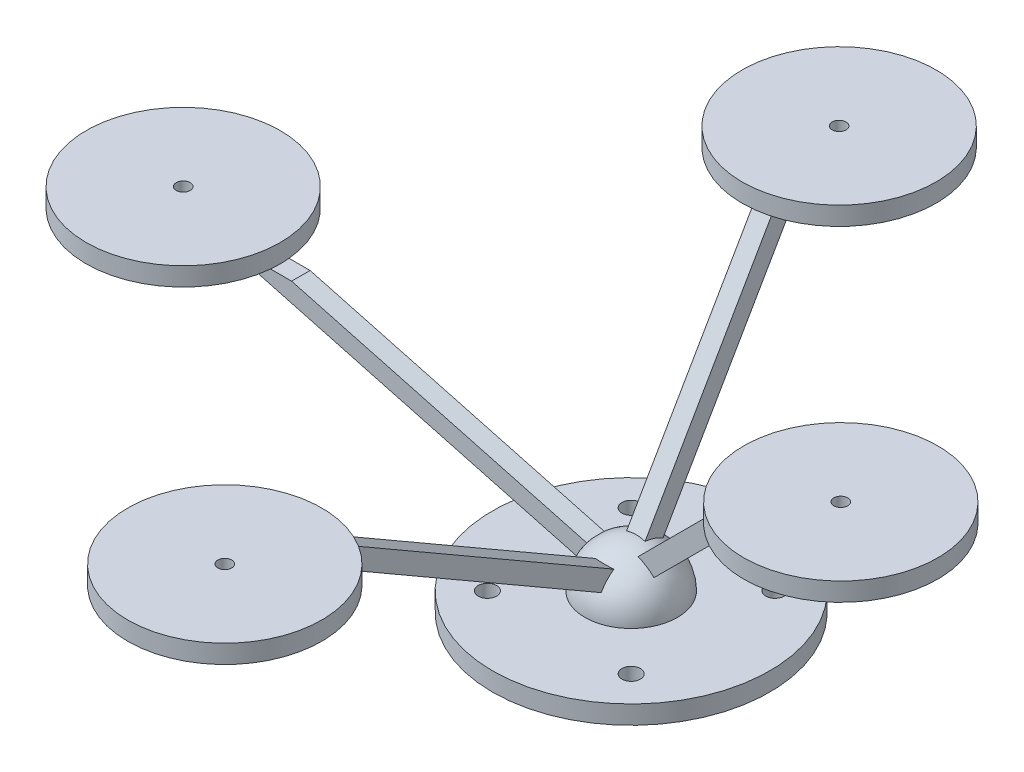
ISO-10303-21;
HEADER;
FILE_DESCRIPTION(('STEP AP214'),'2;1');
FILE_NAME('part.step','',(''),(''),'','','');
FILE_SCHEMA(('AUTOMOTIVE_DESIGN { 1 0 10303 214 1 1 1 1 }'));
ENDSEC;
DATA;
#1=APPLICATION_CONTEXT('core data for automotive mechanical design processes');
#2=APPLICATION_PROTOCOL_DEFINITION('international standard','automotive_design',2000,#1);
#3=PRODUCT_CONTEXT('',#1,'mechanical');
#4=PRODUCT('Part','Part','',(#3));
#5=PRODUCT_RELATED_PRODUCT_CATEGORY('part','',(#4));
#6=PRODUCT_DEFINITION_FORMATION('','',#4);
#7=PRODUCT_DEFINITION_CONTEXT('part definition',#1,'design');
#8=PRODUCT_DEFINITION('design','',#6,#7);
#9=PRODUCT_DEFINITION_SHAPE('','',#8);
#10=(LENGTH_UNIT() NAMED_UNIT(*) SI_UNIT(.MILLI.,.METRE.));
#11=(NAMED_UNIT(*) PLANE_ANGLE_UNIT() SI_UNIT($,.RADIAN.));
#12=(NAMED_UNIT(*) SI_UNIT($,.STERADIAN.) SOLID_ANGLE_UNIT());
#13=UNCERTAINTY_MEASURE_WITH_UNIT(LENGTH_MEASURE(1.E-05),#10,'distance_accuracy_value','');
#14=(GEOMETRIC_REPRESENTATION_CONTEXT(3) GLOBAL_UNCERTAINTY_ASSIGNED_CONTEXT((#13)) GLOBAL_UNIT_ASSIGNED_CONTEXT((#10,
#11,#12)) REPRESENTATION_CONTEXT('',''));
#15=CARTESIAN_POINT('',(0.,0.,0.));
#16=DIRECTION('',(0.,0.,1.));
#17=DIRECTION('',(1.,0.,0.));
#18=AXIS2_PLACEMENT_3D('',#15,#16,#17);
#19=CARTESIAN_POINT('',(0.,2.,0.));
#20=DIRECTION('',(0.,-1.,0.));
#21=DIRECTION('',(0.,0.,-1.));
#22=AXIS2_PLACEMENT_3D('',#19,#20,#21);
#23=SPHERICAL_SURFACE('',#22,5.);
#24=CARTESIAN_POINT('',(0.,2.,1.));
#25=DIRECTION('',(0.,0.,1.));
#26=DIRECTION('',(1.,0.,0.));
#27=AXIS2_PLACEMENT_3D('',#24,#25,#26);
#28=CIRCLE('',#27,4.89897948556636);
#29=CARTESIAN_POINT('',(-4.73205080756888,3.26794919243113,1.));
#30=VERTEX_POINT('',#29);
#31=CARTESIAN_POINT('',(-3.80211352740498,5.08932561001978,1.));
#32=VERTEX_POINT('',#31);
#33=EDGE_CURVE('E348',#30,#32,#28,.F.);
#34=ORIENTED_EDGE('',*,*,#33,.F.);
#35=CARTESIAN_POINT('',(0.,2.,0.));
#36=DIRECTION('',(0.258819045102521,0.965925826289068,0.));
#37=DIRECTION('',(-0.965925826289068,0.258819045102521,0.));
#38=AXIS2_PLACEMENT_3D('',#35,#36,#37);
#39=CIRCLE('',#38,5.);
#40=CARTESIAN_POINT('',(-4.73205080756888,3.26794919243113,-1.));
#41=VERTEX_POINT('',#40);
#42=EDGE_CURVE('E353',#30,#41,#39,.F.);
#43=ORIENTED_EDGE('',*,*,#42,.T.);
#44=CARTESIAN_POINT('',(0.,2.,-1.));
#45=DIRECTION('',(0.,0.,1.));
#46=DIRECTION('',(1.,0.,0.));
#47=AXIS2_PLACEMENT_3D('',#44,#45,#46);
#48=CIRCLE('',#47,4.89897948556636);
#49=CARTESIAN_POINT('',(-3.80211352740498,5.08932561001978,-1.));
#50=VERTEX_POINT('',#49);
#51=EDGE_CURVE('E337',#41,#50,#48,.F.);
#52=ORIENTED_EDGE('',*,*,#51,.T.);
#53=CARTESIAN_POINT('',(0.517638090205043,3.93185165257814,0.));
#54=DIRECTION('',(-0.258819045102521,-0.965925826289068,0.));
#55=DIRECTION('',(0.965925826289068,-0.258819045102521,0.));
#56=AXIS2_PLACEMENT_3D('',#53,#54,#55);
#57=CIRCLE('',#56,4.58257569495584);
#58=EDGE_CURVE('E349',#50,#32,#57,.F.);
#59=ORIENTED_EDGE('',*,*,#58,.T.);
#60=EDGE_LOOP('',(#34,#43,#52,#59));
#61=FACE_BOUND('',#60,.T.);
#62=CARTESIAN_POINT('',(1.74806409779531,6.57649122254147,1.));
#63=VERTEX_POINT('',#62);
#64=CARTESIAN_POINT('',(3.46410161513777,5.46410161513774,1.));
#65=VERTEX_POINT('',#64);
#66=EDGE_CURVE('E345',#63,#65,#28,.F.);
#67=ORIENTED_EDGE('',*,*,#66,.F.);
#68=CARTESIAN_POINT('',(-1.41421356237309,3.4142135623731,0.));
#69=DIRECTION('',(0.707106781186544,-0.707106781186551,0.));
#70=DIRECTION('',(0.707106781186551,0.707106781186544,0.));
#71=AXIS2_PLACEMENT_3D('',#68,#69,#70);
#72=CIRCLE('',#71,4.58257569495584);
#73=CARTESIAN_POINT('',(1.74806409779531,6.57649122254147,-1.));
#74=VERTEX_POINT('',#73);
#75=EDGE_CURVE('E336',#63,#74,#72,.F.);
#76=ORIENTED_EDGE('',*,*,#75,.T.);
#77=CARTESIAN_POINT('',(3.46410161513777,5.46410161513774,-1.));
#78=VERTEX_POINT('',#77);
#79=EDGE_CURVE('E332',#74,#78,#48,.F.);
#80=ORIENTED_EDGE('',*,*,#79,.T.);
#81=CARTESIAN_POINT('',(0.,2.,0.));
#82=DIRECTION('',(-0.707106781186544,0.707106781186551,0.));
#83=DIRECTION('',(-0.707106781186551,-0.707106781186544,0.));
#84=AXIS2_PLACEMENT_3D('',#81,#82,#83);
#85=CIRCLE('',#84,5.);
#86=EDGE_CURVE('E341',#78,#65,#85,.F.);
#87=ORIENTED_EDGE('',*,*,#86,.T.);
#88=EDGE_LOOP('',(#67,#76,#80,#87));
#89=FACE_BOUND('',#88,.T.);
#90=CARTESIAN_POINT('',(0.,2.,0.));
#91=DIRECTION('',(0.,1.,0.));
#92=DIRECTION('',(0.,0.,1.));
#93=AXIS2_PLACEMENT_3D('',#90,#91,#92);
#94=CIRCLE('',#93,5.);
#95=CARTESIAN_POINT('',(0.,2.,5.));
#96=VERTEX_POINT('',#95);
#97=EDGE_CURVE('E325',#96,#96,#94,.T.);
#98=ORIENTED_EDGE('',*,*,#97,.T.);
#99=EDGE_LOOP('',(#98));
#100=FACE_BOUND('',#99,.T.);
#101=CARTESIAN_POINT('',(0.,3.73205080756888,-1.));
#102=DIRECTION('',(0.,-0.866025403784438,0.500000000000001));
#103=DIRECTION('',(0.,-0.500000000000001,-0.866025403784438));
#104=AXIS2_PLACEMENT_3D('',#101,#102,#103);
#105=CIRCLE('',#104,4.58257569495584);
#106=CARTESIAN_POINT('',(-1.,5.96811878506867,2.87298334620742));
#107=VERTEX_POINT('',#106);
#108=CARTESIAN_POINT('',(1.,5.96811878506867,2.87298334620742));
#109=VERTEX_POINT('',#108);
#110=EDGE_CURVE('E177',#107,#109,#105,.F.);
#111=ORIENTED_EDGE('',*,*,#110,.T.);
#112=CARTESIAN_POINT('',(1.,2.,0.));
#113=DIRECTION('',(-1.,0.,0.));
#114=DIRECTION('',(0.,0.,1.));
#115=AXIS2_PLACEMENT_3D('',#112,#113,#114);
#116=CIRCLE('',#115,4.89897948556636);
#117=CARTESIAN_POINT('',(1.,4.44948974278318,4.24264068711928));
#118=VERTEX_POINT('',#117);
#119=EDGE_CURVE('E50',#109,#118,#116,.F.);
#120=ORIENTED_EDGE('',*,*,#119,.T.);
#121=CARTESIAN_POINT('',(0.,2.,0.));
#122=DIRECTION('',(0.,0.866025403784438,-0.500000000000001));
#123=DIRECTION('',(0.,0.500000000000001,0.866025403784438));
#124=AXIS2_PLACEMENT_3D('',#121,#122,#123);
#125=CIRCLE('',#124,5.);
#126=CARTESIAN_POINT('',(-1.,4.44948974278318,4.24264068711928));
#127=VERTEX_POINT('',#126);
#128=EDGE_CURVE('E363',#118,#127,#125,.F.);
#129=ORIENTED_EDGE('',*,*,#128,.T.);
#130=CARTESIAN_POINT('',(-1.,2.,0.));
#131=DIRECTION('',(-1.,0.,0.));
#132=DIRECTION('',(0.,0.,1.));
#133=AXIS2_PLACEMENT_3D('',#130,#131,#132);
#134=CIRCLE('',#133,4.89897948556636);
#135=EDGE_CURVE('E357',#107,#127,#134,.F.);
#136=ORIENTED_EDGE('',*,*,#135,.F.);
#137=EDGE_LOOP('',(#111,#120,#129,#136));
#138=FACE_BOUND('',#137,.T.);
#139=CARTESIAN_POINT('',(0.,2.,0.));
#140=DIRECTION('',(0.,0.500000000000004,0.866025403784436));
#141=DIRECTION('',(0.,-0.866025403784436,0.500000000000004));
#142=AXIS2_PLACEMENT_3D('',#139,#140,#141);
#143=CIRCLE('',#142,5.);
#144=CARTESIAN_POINT('',(-1.,6.24264068711927,-2.4494897427832));
#145=VERTEX_POINT('',#144);
#146=CARTESIAN_POINT('',(1.,6.24264068711927,-2.4494897427832));
#147=VERTEX_POINT('',#146);
#148=EDGE_CURVE('E43',#145,#147,#143,.F.);
#149=ORIENTED_EDGE('',*,*,#148,.T.);
#150=CARTESIAN_POINT('',(1.,6.87298334620741,-0.504017169930936));
#151=VERTEX_POINT('',#150);
#152=EDGE_CURVE('E11',#147,#151,#116,.F.);
#153=ORIENTED_EDGE('',*,*,#152,.T.);
#154=CARTESIAN_POINT('',(0.,3.00000000000001,1.73205080756887));
#155=DIRECTION('',(0.,-0.500000000000004,-0.866025403784436));
#156=DIRECTION('',(0.,0.866025403784436,-0.500000000000004));
#157=AXIS2_PLACEMENT_3D('',#154,#155,#156);
#158=CIRCLE('',#157,4.58257569495584);
#159=CARTESIAN_POINT('',(-1.,6.87298334620742,-0.504017169930936));
#160=VERTEX_POINT('',#159);
#161=EDGE_CURVE('E366',#151,#160,#158,.F.);
#162=ORIENTED_EDGE('',*,*,#161,.T.);
#163=EDGE_CURVE('E360',#145,#160,#134,.F.);
#164=ORIENTED_EDGE('',*,*,#163,.F.);
#165=EDGE_LOOP('',(#149,#153,#162,#164));
#166=FACE_BOUND('',#165,.T.);
#167=ADVANCED_FACE('F39',(#61,#89,#100,#138,#166),#23,.T.);
#168=CARTESIAN_POINT('',(0.,2.,0.));
#169=DIRECTION('',(0.,1.,0.));
#170=DIRECTION('',(0.,0.,1.));
#171=AXIS2_PLACEMENT_3D('',#168,#169,#170);
#172=PLANE('',#171);
#173=ORIENTED_EDGE('',*,*,#97,.F.);
#174=EDGE_LOOP('',(#173));
#175=FACE_BOUND('',#174,.T.);
#176=CARTESIAN_POINT('',(-7.77817459305207,2.,7.77817459305198));
#177=DIRECTION('',(0.,1.,0.));
#178=DIRECTION('',(0.,0.,1.));
#179=AXIS2_PLACEMENT_3D('',#176,#177,#178);
#180=CIRCLE('',#179,1.);
#181=CARTESIAN_POINT('',(-7.77817459305207,2.,8.77817459305198));
#182=VERTEX_POINT('',#181);
#183=EDGE_CURVE('E297',#182,#182,#180,.T.);
#184=ORIENTED_EDGE('',*,*,#183,.F.);
#185=EDGE_LOOP('',(#184));
#186=FACE_BOUND('',#185,.T.);
#187=CARTESIAN_POINT('',(7.77817459305206,2.,-7.77817459305199));
#188=DIRECTION('',(0.,1.,0.));
#189=DIRECTION('',(0.,0.,1.));
#190=AXIS2_PLACEMENT_3D('',#187,#188,#189);
#191=CIRCLE('',#190,1.);
#192=CARTESIAN_POINT('',(7.77817459305206,2.,-6.77817459305198));
#193=VERTEX_POINT('',#192);
#194=EDGE_CURVE('E313',#193,#193,#191,.T.);
#195=ORIENTED_EDGE('',*,*,#194,.F.);
#196=EDGE_LOOP('',(#195));
#197=FACE_BOUND('',#196,.T.);
#198=CARTESIAN_POINT('',(0.,2.,0.));
#199=DIRECTION('',(0.,1.,0.));
#200=DIRECTION('',(0.,0.,1.));
#201=AXIS2_PLACEMENT_3D('',#198,#199,#200);
#202=CIRCLE('',#201,15.);
#203=CARTESIAN_POINT('',(0.,2.,15.));
#204=VERTEX_POINT('',#203);
#205=EDGE_CURVE('E321',#204,#204,#202,.T.);
#206=ORIENTED_EDGE('',*,*,#205,.T.);
#207=EDGE_LOOP('',(#206));
#208=FACE_BOUND('',#207,.T.);
#209=CARTESIAN_POINT('',(-7.77817459305204,2.,-7.77817459305201));
#210=DIRECTION('',(0.,1.,0.));
#211=DIRECTION('',(0.,0.,1.));
#212=AXIS2_PLACEMENT_3D('',#209,#210,#211);
#213=CIRCLE('',#212,0.999999999999995);
#214=CARTESIAN_POINT('',(-7.77817459305204,2.,-6.77817459305201));
#215=VERTEX_POINT('',#214);
#216=EDGE_CURVE('E305',#215,#215,#213,.T.);
#217=ORIENTED_EDGE('',*,*,#216,.F.);
#218=EDGE_LOOP('',(#217));
#219=FACE_BOUND('',#218,.T.);
#220=CARTESIAN_POINT('',(7.77817459305204,2.,7.77817459305201));
#221=DIRECTION('',(0.,1.,0.));
#222=DIRECTION('',(0.,0.,1.));
#223=AXIS2_PLACEMENT_3D('',#220,#221,#222);
#224=CIRCLE('',#223,1.);
#225=CARTESIAN_POINT('',(7.77817459305204,2.,8.77817459305201));
#226=VERTEX_POINT('',#225);
#227=EDGE_CURVE('E289',#226,#226,#224,.T.);
#228=ORIENTED_EDGE('',*,*,#227,.F.);
#229=EDGE_LOOP('',(#228));
#230=FACE_BOUND('',#229,.T.);
#231=ADVANCED_FACE('F463',(#175,#186,#197,#208,#219,#230),#172,.T.);
#232=CARTESIAN_POINT('',(0.,0.,0.));
#233=DIRECTION('',(0.,1.,0.));
#234=DIRECTION('',(0.,0.,1.));
#235=AXIS2_PLACEMENT_3D('',#232,#233,#234);
#236=PLANE('',#235);
#237=CARTESIAN_POINT('',(0.,0.,0.));
#238=DIRECTION('',(0.,1.,0.));
#239=DIRECTION('',(0.,0.,1.));
#240=AXIS2_PLACEMENT_3D('',#237,#238,#239);
#241=CIRCLE('',#240,15.);
#242=CARTESIAN_POINT('',(0.,0.,15.));
#243=VERTEX_POINT('',#242);
#244=EDGE_CURVE('E317',#243,#243,#241,.T.);
#245=ORIENTED_EDGE('',*,*,#244,.F.);
#246=EDGE_LOOP('',(#245));
#247=FACE_BOUND('',#246,.T.);
#248=CARTESIAN_POINT('',(7.77817459305206,0.,-7.77817459305199));
#249=DIRECTION('',(0.,1.,0.));
#250=DIRECTION('',(0.,0.,1.));
#251=AXIS2_PLACEMENT_3D('',#248,#249,#250);
#252=CIRCLE('',#251,1.);
#253=CARTESIAN_POINT('',(7.77817459305206,0.,-6.77817459305198));
#254=VERTEX_POINT('',#253);
#255=EDGE_CURVE('E309',#254,#254,#252,.T.);
#256=ORIENTED_EDGE('',*,*,#255,.T.);
#257=EDGE_LOOP('',(#256));
#258=FACE_BOUND('',#257,.T.);
#259=CARTESIAN_POINT('',(-7.77817459305204,0.,-7.77817459305201));
#260=DIRECTION('',(0.,1.,0.));
#261=DIRECTION('',(0.,0.,1.));
#262=AXIS2_PLACEMENT_3D('',#259,#260,#261);
#263=CIRCLE('',#262,0.999999999999995);
#264=CARTESIAN_POINT('',(-7.77817459305204,0.,-6.77817459305201));
#265=VERTEX_POINT('',#264);
#266=EDGE_CURVE('E301',#265,#265,#263,.T.);
#267=ORIENTED_EDGE('',*,*,#266,.T.);
#268=EDGE_LOOP('',(#267));
#269=FACE_BOUND('',#268,.T.);
#270=CARTESIAN_POINT('',(-7.77817459305207,0.,7.77817459305198));
#271=DIRECTION('',(0.,1.,0.));
#272=DIRECTION('',(0.,0.,1.));
#273=AXIS2_PLACEMENT_3D('',#270,#271,#272);
#274=CIRCLE('',#273,1.);
#275=CARTESIAN_POINT('',(-7.77817459305207,0.,8.77817459305198));
#276=VERTEX_POINT('',#275);
#277=EDGE_CURVE('E293',#276,#276,#274,.T.);
#278=ORIENTED_EDGE('',*,*,#277,.T.);
#279=EDGE_LOOP('',(#278));
#280=FACE_BOUND('',#279,.T.);
#281=CARTESIAN_POINT('',(7.77817459305204,0.,7.77817459305201));
#282=DIRECTION('',(0.,1.,0.));
#283=DIRECTION('',(0.,0.,1.));
#284=AXIS2_PLACEMENT_3D('',#281,#282,#283);
#285=CIRCLE('',#284,1.);
#286=CARTESIAN_POINT('',(7.77817459305204,0.,8.77817459305201));
#287=VERTEX_POINT('',#286);
#288=EDGE_CURVE('E288',#287,#287,#285,.T.);
#289=ORIENTED_EDGE('',*,*,#288,.T.);
#290=EDGE_LOOP('',(#289));
#291=FACE_BOUND('',#290,.T.);
#292=ADVANCED_FACE('F471',(#247,#258,#269,#280,#291),#236,.F.);
#293=CARTESIAN_POINT('',(0.,2.,0.));
#294=DIRECTION('',(0.,-1.,0.));
#295=DIRECTION('',(0.,0.,-1.));
#296=AXIS2_PLACEMENT_3D('',#293,#294,#295);
#297=CYLINDRICAL_SURFACE('',#296,15.);
#298=ORIENTED_EDGE('',*,*,#205,.F.);
#299=EDGE_LOOP('',(#298));
#300=FACE_BOUND('',#299,.T.);
#301=ORIENTED_EDGE('',*,*,#244,.T.);
#302=EDGE_LOOP('',(#301));
#303=FACE_BOUND('',#302,.T.);
#304=ADVANCED_FACE('F41',(#300,#303),#297,.T.);
#305=CARTESIAN_POINT('',(7.77817459305206,2.,-7.77817459305199));
#306=DIRECTION('',(0.,-1.,0.));
#307=DIRECTION('',(0.,0.,-1.));
#308=AXIS2_PLACEMENT_3D('',#305,#306,#307);
#309=CYLINDRICAL_SURFACE('',#308,1.);
#310=ORIENTED_EDGE('',*,*,#194,.T.);
#311=EDGE_LOOP('',(#310));
#312=FACE_BOUND('',#311,.T.);
#313=ORIENTED_EDGE('',*,*,#255,.F.);
#314=EDGE_LOOP('',(#313));
#315=FACE_BOUND('',#314,.T.);
#316=ADVANCED_FACE('F492',(#312,#315),#309,.F.);
#317=CARTESIAN_POINT('',(-7.77817459305204,2.,-7.77817459305201));
#318=DIRECTION('',(0.,-1.,0.));
#319=DIRECTION('',(0.,0.,-1.));
#320=AXIS2_PLACEMENT_3D('',#317,#318,#319);
#321=CYLINDRICAL_SURFACE('',#320,0.999999999999995);
#322=ORIENTED_EDGE('',*,*,#216,.T.);
#323=EDGE_LOOP('',(#322));
#324=FACE_BOUND('',#323,.T.);
#325=ORIENTED_EDGE('',*,*,#266,.F.);
#326=EDGE_LOOP('',(#325));
#327=FACE_BOUND('',#326,.T.);
#328=ADVANCED_FACE('F488',(#324,#327),#321,.F.);
#329=CARTESIAN_POINT('',(-7.77817459305207,2.,7.77817459305198));
#330=DIRECTION('',(0.,-1.,0.));
#331=DIRECTION('',(0.,0.,-1.));
#332=AXIS2_PLACEMENT_3D('',#329,#330,#331);
#333=CYLINDRICAL_SURFACE('',#332,1.);
#334=ORIENTED_EDGE('',*,*,#183,.T.);
#335=EDGE_LOOP('',(#334));
#336=FACE_BOUND('',#335,.T.);
#337=ORIENTED_EDGE('',*,*,#277,.F.);
#338=EDGE_LOOP('',(#337));
#339=FACE_BOUND('',#338,.T.);
#340=ADVANCED_FACE('F484',(#336,#339),#333,.F.);
#341=CARTESIAN_POINT('',(7.77817459305204,2.,7.77817459305201));
#342=DIRECTION('',(0.,-1.,0.));
#343=DIRECTION('',(0.,0.,-1.));
#344=AXIS2_PLACEMENT_3D('',#341,#342,#343);
#345=CYLINDRICAL_SURFACE('',#344,1.);
#346=ORIENTED_EDGE('',*,*,#227,.T.);
#347=EDGE_LOOP('',(#346));
#348=FACE_BOUND('',#347,.T.);
#349=ORIENTED_EDGE('',*,*,#288,.F.);
#350=EDGE_LOOP('',(#349));
#351=FACE_BOUND('',#350,.T.);
#352=ADVANCED_FACE('F480',(#348,#351),#345,.F.);
#353=CARTESIAN_POINT('',(0.,0.,-1.));
#354=DIRECTION('',(0.,0.,1.));
#355=DIRECTION('',(1.,0.,0.));
#356=AXIS2_PLACEMENT_3D('',#353,#354,#355);
#357=PLANE('',#356);
#358=ORIENTED_EDGE('',*,*,#79,.F.);
#359=DIRECTION('',(-0.707106781186551,-0.707106781186544,0.));
#360=VECTOR('',#359,1.);
#361=CARTESIAN_POINT('',(0.,4.82842712474617,-1.));
#362=LINE('',#361,#360);
#363=CARTESIAN_POINT('',(14.8492424049176,19.6776695296636,-1.));
#364=VERTEX_POINT('',#363);
#365=EDGE_CURVE('E265',#364,#74,#362,.T.);
#366=ORIENTED_EDGE('',*,*,#365,.F.);
#367=DIRECTION('',(-1.,0.,0.));
#368=VECTOR('',#367,1.);
#369=CARTESIAN_POINT('',(14.8492424049176,19.6776695296636,-1.));
#370=LINE('',#369,#368);
#371=CARTESIAN_POINT('',(17.6776695296638,19.6776695296636,-1.));
#372=VERTEX_POINT('',#371);
#373=EDGE_CURVE('E261',#372,#364,#370,.T.);
#374=ORIENTED_EDGE('',*,*,#373,.F.);
#375=DIRECTION('',(0.707106781186551,0.707106781186544,0.));
#376=VECTOR('',#375,1.);
#377=CARTESIAN_POINT('',(0.,2.,-1.));
#378=LINE('',#377,#376);
#379=EDGE_CURVE('E257',#78,#372,#378,.T.);
#380=ORIENTED_EDGE('',*,*,#379,.F.);
#381=EDGE_LOOP('',(#358,#366,#374,#380));
#382=FACE_BOUND('',#381,.T.);
#383=ADVANCED_FACE('F483',(#382),#357,.F.);
#384=CARTESIAN_POINT('',(0.,0.,1.));
#385=DIRECTION('',(0.,0.,1.));
#386=DIRECTION('',(1.,0.,0.));
#387=AXIS2_PLACEMENT_3D('',#384,#385,#386);
#388=PLANE('',#387);
#389=DIRECTION('',(-0.707106781186551,-0.707106781186544,0.));
#390=VECTOR('',#389,1.);
#391=CARTESIAN_POINT('',(0.,4.82842712474617,1.));
#392=LINE('',#391,#390);
#393=CARTESIAN_POINT('',(14.8492424049176,19.6776695296636,1.));
#394=VERTEX_POINT('',#393);
#395=EDGE_CURVE('E241',#394,#63,#392,.T.);
#396=ORIENTED_EDGE('',*,*,#395,.T.);
#397=ORIENTED_EDGE('',*,*,#66,.T.);
#398=DIRECTION('',(0.707106781186551,0.707106781186544,0.));
#399=VECTOR('',#398,1.);
#400=CARTESIAN_POINT('',(0.,2.,1.));
#401=LINE('',#400,#399);
#402=CARTESIAN_POINT('',(17.6776695296638,19.6776695296636,1.));
#403=VERTEX_POINT('',#402);
#404=EDGE_CURVE('E234',#65,#403,#401,.T.);
#405=ORIENTED_EDGE('',*,*,#404,.T.);
#406=DIRECTION('',(-1.,0.,0.));
#407=VECTOR('',#406,1.);
#408=CARTESIAN_POINT('',(14.8492424049176,19.6776695296636,1.));
#409=LINE('',#408,#407);
#410=EDGE_CURVE('E238',#403,#394,#409,.T.);
#411=ORIENTED_EDGE('',*,*,#410,.T.);
#412=EDGE_LOOP('',(#396,#397,#405,#411));
#413=FACE_BOUND('',#412,.T.);
#414=ADVANCED_FACE('F553',(#413),#388,.T.);
#415=CARTESIAN_POINT('',(0.,4.82842712474617,1.));
#416=DIRECTION('',(0.707106781186544,-0.707106781186551,0.));
#417=DIRECTION('',(0.707106781186551,0.707106781186544,0.));
#418=AXIS2_PLACEMENT_3D('',#415,#416,#417);
#419=PLANE('',#418);
#420=ORIENTED_EDGE('',*,*,#75,.F.);
#421=ORIENTED_EDGE('',*,*,#395,.F.);
#422=DIRECTION('',(0.,0.,-1.));
#423=VECTOR('',#422,1.);
#424=CARTESIAN_POINT('',(14.8492424049176,19.6776695296636,1.));
#425=LINE('',#424,#423);
#426=EDGE_CURVE('E281',#394,#364,#425,.T.);
#427=ORIENTED_EDGE('',*,*,#426,.T.);
#428=ORIENTED_EDGE('',*,*,#365,.T.);
#429=EDGE_LOOP('',(#420,#421,#427,#428));
#430=FACE_BOUND('',#429,.T.);
#431=ADVANCED_FACE('F563',(#430),#419,.F.);
#432=CARTESIAN_POINT('',(0.,2.,1.));
#433=DIRECTION('',(-0.707106781186544,0.707106781186551,0.));
#434=DIRECTION('',(-0.707106781186551,-0.707106781186544,0.));
#435=AXIS2_PLACEMENT_3D('',#432,#433,#434);
#436=PLANE('',#435);
#437=ORIENTED_EDGE('',*,*,#86,.F.);
#438=ORIENTED_EDGE('',*,*,#379,.T.);
#439=DIRECTION('',(0.,0.,-1.));
#440=VECTOR('',#439,1.);
#441=CARTESIAN_POINT('',(17.6776695296638,19.6776695296636,1.));
#442=LINE('',#441,#440);
#443=EDGE_CURVE('E284',#403,#372,#442,.T.);
#444=ORIENTED_EDGE('',*,*,#443,.F.);
#445=ORIENTED_EDGE('',*,*,#404,.F.);
#446=EDGE_LOOP('',(#437,#438,#444,#445));
#447=FACE_BOUND('',#446,.T.);
#448=ADVANCED_FACE('F572',(#447),#436,.F.);
#449=DIRECTION('',(0.965925826289068,-0.258819045102521,0.));
#450=VECTOR('',#449,1.);
#451=CARTESIAN_POINT('',(0.,2.,1.));
#452=LINE('',#451,#450);
#453=CARTESIAN_POINT('',(-43.4666621830081,13.6468570296135,1.));
#454=VERTEX_POINT('',#453);
#455=EDGE_CURVE('E230',#454,#30,#452,.T.);
#456=ORIENTED_EDGE('',*,*,#455,.T.);
#457=ORIENTED_EDGE('',*,*,#33,.T.);
#458=DIRECTION('',(-0.965925826289068,0.258819045102521,0.));
#459=VECTOR('',#458,1.);
#460=CARTESIAN_POINT('',(-35.7392555726955,13.6468570296135,1.));
#461=LINE('',#460,#459);
#462=CARTESIAN_POINT('',(-35.7392555726955,13.6468570296135,1.));
#463=VERTEX_POINT('',#462);
#464=EDGE_CURVE('E245',#32,#463,#461,.T.);
#465=ORIENTED_EDGE('',*,*,#464,.T.);
#466=DIRECTION('',(-1.,0.,0.));
#467=VECTOR('',#466,1.);
#468=CARTESIAN_POINT('',(-43.4666621830081,13.6468570296135,1.));
#469=LINE('',#468,#467);
#470=CARTESIAN_POINT('',(-38.0143897028246,13.6468570296135,1.));
#471=VERTEX_POINT('',#470);
#472=EDGE_CURVE('E249',#463,#471,#469,.T.);
#473=ORIENTED_EDGE('',*,*,#472,.T.);
#474=EDGE_CURVE('E248',#471,#454,#469,.T.);
#475=ORIENTED_EDGE('',*,*,#474,.T.);
#476=EDGE_LOOP('',(#456,#457,#465,#473,#475));
#477=FACE_BOUND('',#476,.T.);
#478=ADVANCED_FACE('F566',(#477),#388,.T.);
#479=ORIENTED_EDGE('',*,*,#51,.F.);
#480=DIRECTION('',(0.965925826289068,-0.258819045102521,0.));
#481=VECTOR('',#480,1.);
#482=CARTESIAN_POINT('',(0.,2.,-1.));
#483=LINE('',#482,#481);
#484=CARTESIAN_POINT('',(-43.4666621830081,13.6468570296135,-1.));
#485=VERTEX_POINT('',#484);
#486=EDGE_CURVE('E226',#485,#41,#483,.T.);
#487=ORIENTED_EDGE('',*,*,#486,.F.);
#488=DIRECTION('',(-1.,0.,0.));
#489=VECTOR('',#488,1.);
#490=CARTESIAN_POINT('',(-43.4666621830081,13.6468570296135,-1.));
#491=LINE('',#490,#489);
#492=CARTESIAN_POINT('',(-38.0143897028246,13.6468570296135,-1.));
#493=VERTEX_POINT('',#492);
#494=EDGE_CURVE('E272',#493,#485,#491,.T.);
#495=ORIENTED_EDGE('',*,*,#494,.F.);
#496=CARTESIAN_POINT('',(-35.7392555726955,13.6468570296135,-1.));
#497=VERTEX_POINT('',#496);
#498=EDGE_CURVE('E235',#497,#493,#491,.T.);
#499=ORIENTED_EDGE('',*,*,#498,.F.);
#500=DIRECTION('',(-0.965925826289068,0.258819045102521,0.));
#501=VECTOR('',#500,1.);
#502=CARTESIAN_POINT('',(-35.7392555726955,13.6468570296135,-1.));
#503=LINE('',#502,#501);
#504=EDGE_CURVE('E269',#50,#497,#503,.T.);
#505=ORIENTED_EDGE('',*,*,#504,.F.);
#506=EDGE_LOOP('',(#479,#487,#495,#499,#505));
#507=FACE_BOUND('',#506,.T.);
#508=ADVANCED_FACE('F556',(#507),#357,.F.);
#509=CARTESIAN_POINT('',(0.,2.,1.));
#510=DIRECTION('',(0.258819045102521,0.965925826289068,0.));
#511=DIRECTION('',(-0.965925826289068,0.258819045102521,0.));
#512=AXIS2_PLACEMENT_3D('',#509,#510,#511);
#513=PLANE('',#512);
#514=ORIENTED_EDGE('',*,*,#42,.F.);
#515=ORIENTED_EDGE('',*,*,#455,.F.);
#516=DIRECTION('',(0.,0.,-1.));
#517=VECTOR('',#516,1.);
#518=CARTESIAN_POINT('',(-43.4666621830081,13.6468570296135,1.));
#519=LINE('',#518,#517);
#520=EDGE_CURVE('E253',#454,#485,#519,.T.);
#521=ORIENTED_EDGE('',*,*,#520,.T.);
#522=ORIENTED_EDGE('',*,*,#486,.T.);
#523=EDGE_LOOP('',(#514,#515,#521,#522));
#524=FACE_BOUND('',#523,.T.);
#525=ADVANCED_FACE('F478',(#524),#513,.F.);
#526=CARTESIAN_POINT('',(-35.7392555726955,13.6468570296135,1.));
#527=DIRECTION('',(-0.258819045102521,-0.965925826289068,0.));
#528=DIRECTION('',(0.965925826289068,-0.258819045102521,0.));
#529=AXIS2_PLACEMENT_3D('',#526,#527,#528);
#530=PLANE('',#529);
#531=ORIENTED_EDGE('',*,*,#58,.F.);
#532=ORIENTED_EDGE('',*,*,#504,.T.);
#533=DIRECTION('',(0.,0.,-1.));
#534=VECTOR('',#533,1.);
#535=CARTESIAN_POINT('',(-35.7392555726955,13.6468570296135,1.));
#536=LINE('',#535,#534);
#537=EDGE_CURVE('E277',#463,#497,#536,.T.);
#538=ORIENTED_EDGE('',*,*,#537,.F.);
#539=ORIENTED_EDGE('',*,*,#464,.F.);
#540=EDGE_LOOP('',(#531,#532,#538,#539));
#541=FACE_BOUND('',#540,.T.);
#542=ADVANCED_FACE('F600',(#541),#530,.F.);
#543=CARTESIAN_POINT('',(-43.4666621830081,13.6468570296135,1.));
#544=DIRECTION('',(0.,-1.,0.));
#545=DIRECTION('',(1.,0.,0.));
#546=AXIS2_PLACEMENT_3D('',#543,#544,#545);
#547=PLANE('',#546);
#548=CARTESIAN_POINT('',(-48.4666621830081,13.6468570296135,0.));
#549=DIRECTION('',(0.,1.,0.));
#550=DIRECTION('',(0.,0.,1.));
#551=AXIS2_PLACEMENT_3D('',#548,#549,#550);
#552=CIRCLE('',#551,10.5);
#553=EDGE_CURVE('E210',#471,#493,#552,.T.);
#554=ORIENTED_EDGE('',*,*,#553,.F.);
#555=ORIENTED_EDGE('',*,*,#472,.F.);
#556=ORIENTED_EDGE('',*,*,#537,.T.);
#557=ORIENTED_EDGE('',*,*,#498,.T.);
#558=EDGE_LOOP('',(#554,#555,#556,#557));
#559=FACE_BOUND('',#558,.T.);
#560=ADVANCED_FACE('F607',(#559),#547,.F.);
#561=CARTESIAN_POINT('',(22.6776695296638,19.6776695296636,0.));
#562=DIRECTION('',(0.,1.,0.));
#563=DIRECTION('',(0.,0.,1.));
#564=AXIS2_PLACEMENT_3D('',#561,#562,#563);
#565=PLANE('',#564);
#566=CARTESIAN_POINT('',(22.6776695296638,19.6776695296636,0.));
#567=DIRECTION('',(0.,1.,0.));
#568=DIRECTION('',(0.,0.,1.));
#569=AXIS2_PLACEMENT_3D('',#566,#567,#568);
#570=CIRCLE('',#569,10.5);
#571=CARTESIAN_POINT('',(22.6776695296638,19.6776695296636,10.5));
#572=VERTEX_POINT('',#571);
#573=EDGE_CURVE('E218',#572,#572,#570,.T.);
#574=ORIENTED_EDGE('',*,*,#573,.F.);
#575=EDGE_LOOP('',(#574));
#576=FACE_BOUND('',#575,.T.);
#577=CARTESIAN_POINT('',(22.6776695296638,19.6776695296636,0.));
#578=DIRECTION('',(0.,1.,0.));
#579=DIRECTION('',(0.,0.,1.));
#580=AXIS2_PLACEMENT_3D('',#577,#578,#579);
#581=CIRCLE('',#580,0.750000000000002);
#582=CARTESIAN_POINT('',(22.6776695296638,19.6776695296636,0.750000000000002));
#583=VERTEX_POINT('',#582);
#584=EDGE_CURVE('E209',#583,#583,#581,.T.);
#585=ORIENTED_EDGE('',*,*,#584,.T.);
#586=EDGE_LOOP('',(#585));
#587=FACE_BOUND('',#586,.T.);
#588=ORIENTED_EDGE('',*,*,#443,.T.);
#589=ORIENTED_EDGE('',*,*,#373,.T.);
#590=ORIENTED_EDGE('',*,*,#426,.F.);
#591=ORIENTED_EDGE('',*,*,#410,.F.);
#592=EDGE_LOOP('',(#588,#589,#590,#591));
#593=FACE_BOUND('',#592,.T.);
#594=ADVANCED_FACE('F614',(#576,#587,#593),#565,.F.);
#595=CARTESIAN_POINT('',(22.6776695296638,21.6776695296636,0.));
#596=DIRECTION('',(0.,1.,0.));
#597=DIRECTION('',(0.,0.,1.));
#598=AXIS2_PLACEMENT_3D('',#595,#596,#597);
#599=PLANE('',#598);
#600=CARTESIAN_POINT('',(22.6776695296638,21.6776695296636,0.));
#601=DIRECTION('',(0.,1.,0.));
#602=DIRECTION('',(0.,0.,1.));
#603=AXIS2_PLACEMENT_3D('',#600,#601,#602);
#604=CIRCLE('',#603,10.5);
#605=CARTESIAN_POINT('',(22.6776695296638,21.6776695296636,10.5));
#606=VERTEX_POINT('',#605);
#607=EDGE_CURVE('E222',#606,#606,#604,.T.);
#608=ORIENTED_EDGE('',*,*,#607,.T.);
#609=EDGE_LOOP('',(#608));
#610=FACE_BOUND('',#609,.T.);
#611=CARTESIAN_POINT('',(22.6776695296638,21.6776695296636,0.));
#612=DIRECTION('',(0.,1.,0.));
#613=DIRECTION('',(0.,0.,1.));
#614=AXIS2_PLACEMENT_3D('',#611,#612,#613);
#615=CIRCLE('',#614,0.750000000000002);
#616=CARTESIAN_POINT('',(22.6776695296638,21.6776695296636,0.750000000000002));
#617=VERTEX_POINT('',#616);
#618=EDGE_CURVE('E214',#617,#617,#615,.T.);
#619=ORIENTED_EDGE('',*,*,#618,.F.);
#620=EDGE_LOOP('',(#619));
#621=FACE_BOUND('',#620,.T.);
#622=ADVANCED_FACE('F622',(#610,#621),#599,.T.);
#623=CARTESIAN_POINT('',(22.6776695296638,21.6776695296636,0.));
#624=DIRECTION('',(0.,-1.,0.));
#625=DIRECTION('',(0.,0.,-1.));
#626=AXIS2_PLACEMENT_3D('',#623,#624,#625);
#627=CYLINDRICAL_SURFACE('',#626,10.5);
#628=ORIENTED_EDGE('',*,*,#607,.F.);
#629=EDGE_LOOP('',(#628));
#630=FACE_BOUND('',#629,.T.);
#631=ORIENTED_EDGE('',*,*,#573,.T.);
#632=EDGE_LOOP('',(#631));
#633=FACE_BOUND('',#632,.T.);
#634=ADVANCED_FACE('F630',(#630,#633),#627,.T.);
#635=CARTESIAN_POINT('',(22.6776695296638,21.6776695296636,0.));
#636=DIRECTION('',(0.,-1.,0.));
#637=DIRECTION('',(0.,0.,-1.));
#638=AXIS2_PLACEMENT_3D('',#635,#636,#637);
#639=CYLINDRICAL_SURFACE('',#638,0.750000000000002);
#640=ORIENTED_EDGE('',*,*,#618,.T.);
#641=EDGE_LOOP('',(#640));
#642=FACE_BOUND('',#641,.T.);
#643=ORIENTED_EDGE('',*,*,#584,.F.);
#644=EDGE_LOOP('',(#643));
#645=FACE_BOUND('',#644,.T.);
#646=ADVANCED_FACE('F638',(#642,#645),#639,.F.);
#647=CARTESIAN_POINT('',(-48.4666621830081,13.6468570296135,0.));
#648=DIRECTION('',(0.,1.,0.));
#649=DIRECTION('',(0.,0.,1.));
#650=AXIS2_PLACEMENT_3D('',#647,#648,#649);
#651=PLANE('',#650);
#652=CARTESIAN_POINT('',(-48.4666621830081,13.6468570296135,0.));
#653=DIRECTION('',(0.,1.,0.));
#654=DIRECTION('',(0.,0.,1.));
#655=AXIS2_PLACEMENT_3D('',#652,#653,#654);
#656=CIRCLE('',#655,0.749999999999999);
#657=CARTESIAN_POINT('',(-48.4666621830081,13.6468570296135,0.749999999999999));
#658=VERTEX_POINT('',#657);
#659=EDGE_CURVE('E196',#658,#658,#656,.T.);
#660=ORIENTED_EDGE('',*,*,#659,.T.);
#661=EDGE_LOOP('',(#660));
#662=FACE_BOUND('',#661,.T.);
#663=EDGE_CURVE('E201',#493,#471,#552,.T.);
#664=ORIENTED_EDGE('',*,*,#663,.F.);
#665=ORIENTED_EDGE('',*,*,#494,.T.);
#666=ORIENTED_EDGE('',*,*,#520,.F.);
#667=ORIENTED_EDGE('',*,*,#474,.F.);
#668=EDGE_LOOP('',(#664,#665,#666,#667));
#669=FACE_BOUND('',#668,.T.);
#670=ADVANCED_FACE('F645',(#662,#669),#651,.F.);
#671=CARTESIAN_POINT('',(-48.4666621830081,15.6468570296135,0.));
#672=DIRECTION('',(0.,1.,0.));
#673=DIRECTION('',(0.,0.,1.));
#674=AXIS2_PLACEMENT_3D('',#671,#672,#673);
#675=PLANE('',#674);
#676=CARTESIAN_POINT('',(-48.4666621830081,15.6468570296135,0.));
#677=DIRECTION('',(0.,1.,0.));
#678=DIRECTION('',(0.,0.,1.));
#679=AXIS2_PLACEMENT_3D('',#676,#677,#678);
#680=CIRCLE('',#679,10.5);
#681=CARTESIAN_POINT('',(-48.4666621830081,15.6468570296135,10.5));
#682=VERTEX_POINT('',#681);
#683=EDGE_CURVE('E205',#682,#682,#680,.T.);
#684=ORIENTED_EDGE('',*,*,#683,.T.);
#685=EDGE_LOOP('',(#684));
#686=FACE_BOUND('',#685,.T.);
#687=CARTESIAN_POINT('',(-48.4666621830081,15.6468570296135,0.));
#688=DIRECTION('',(0.,1.,0.));
#689=DIRECTION('',(0.,0.,1.));
#690=AXIS2_PLACEMENT_3D('',#687,#688,#689);
#691=CIRCLE('',#690,0.749999999999999);
#692=CARTESIAN_POINT('',(-48.4666621830081,15.6468570296135,0.749999999999999));
#693=VERTEX_POINT('',#692);
#694=EDGE_CURVE('E197',#693,#693,#691,.T.);
#695=ORIENTED_EDGE('',*,*,#694,.F.);
#696=EDGE_LOOP('',(#695));
#697=FACE_BOUND('',#696,.T.);
#698=ADVANCED_FACE('F652',(#686,#697),#675,.T.);
#699=CARTESIAN_POINT('',(-48.4666621830081,15.6468570296135,0.));
#700=DIRECTION('',(0.,-1.,0.));
#701=DIRECTION('',(0.,0.,-1.));
#702=AXIS2_PLACEMENT_3D('',#699,#700,#701);
#703=CYLINDRICAL_SURFACE('',#702,10.5);
#704=ORIENTED_EDGE('',*,*,#683,.F.);
#705=EDGE_LOOP('',(#704));
#706=FACE_BOUND('',#705,.T.);
#707=ORIENTED_EDGE('',*,*,#553,.T.);
#708=ORIENTED_EDGE('',*,*,#663,.T.);
#709=EDGE_LOOP('',(#707,#708));
#710=FACE_BOUND('',#709,.T.);
#711=ADVANCED_FACE('F660',(#706,#710),#703,.T.);
#712=CARTESIAN_POINT('',(-48.4666621830081,15.6468570296135,0.));
#713=DIRECTION('',(0.,-1.,0.));
#714=DIRECTION('',(0.,0.,-1.));
#715=AXIS2_PLACEMENT_3D('',#712,#713,#714);
#716=CYLINDRICAL_SURFACE('',#715,0.749999999999999);
#717=ORIENTED_EDGE('',*,*,#694,.T.);
#718=EDGE_LOOP('',(#717));
#719=FACE_BOUND('',#718,.T.);
#720=ORIENTED_EDGE('',*,*,#659,.F.);
#721=EDGE_LOOP('',(#720));
#722=FACE_BOUND('',#721,.T.);
#723=ADVANCED_FACE('F668',(#719,#722),#716,.F.);
#724=CARTESIAN_POINT('',(1.,0.,0.));
#725=DIRECTION('',(-1.,0.,0.));
#726=DIRECTION('',(0.,0.,1.));
#727=AXIS2_PLACEMENT_3D('',#724,#725,#726);
#728=PLANE('',#727);
#729=ORIENTED_EDGE('',*,*,#119,.F.);
#730=DIRECTION('',(0.,0.500000000000001,0.866025403784438));
#731=VECTOR('',#730,1.);
#732=CARTESIAN_POINT('',(1.,4.3094010767585,0.));
#733=LINE('',#732,#731);
#734=CARTESIAN_POINT('',(1.,24.5,34.9711431702997));
#735=VERTEX_POINT('',#734);
#736=EDGE_CURVE('E397',#109,#735,#733,.T.);
#737=ORIENTED_EDGE('',*,*,#736,.T.);
#738=DIRECTION('',(0.,0.,1.));
#739=VECTOR('',#738,1.);
#740=CARTESIAN_POINT('',(1.,24.5,38.9711431702997));
#741=LINE('',#740,#739);
#742=CARTESIAN_POINT('',(1.,24.5,38.9711431702997));
#743=VERTEX_POINT('',#742);
#744=EDGE_CURVE('E182',#735,#743,#741,.T.);
#745=ORIENTED_EDGE('',*,*,#744,.T.);
#746=DIRECTION('',(0.,-0.500000000000001,-0.866025403784438));
#747=VECTOR('',#746,1.);
#748=CARTESIAN_POINT('',(1.,2.,0.));
#749=LINE('',#748,#747);
#750=EDGE_CURVE('E168',#743,#118,#749,.T.);
#751=ORIENTED_EDGE('',*,*,#750,.T.);
#752=EDGE_LOOP('',(#729,#737,#745,#751));
#753=FACE_BOUND('',#752,.T.);
#754=ADVANCED_FACE('F675',(#753),#728,.F.);
#755=CARTESIAN_POINT('',(-1.,0.,0.));
#756=DIRECTION('',(-1.,0.,0.));
#757=DIRECTION('',(0.,0.,1.));
#758=AXIS2_PLACEMENT_3D('',#755,#756,#757);
#759=PLANE('',#758);
#760=DIRECTION('',(0.,0.500000000000001,0.866025403784438));
#761=VECTOR('',#760,1.);
#762=CARTESIAN_POINT('',(-1.,4.3094010767585,0.));
#763=LINE('',#762,#761);
#764=CARTESIAN_POINT('',(-1.,24.5,34.9711431702997));
#765=VERTEX_POINT('',#764);
#766=EDGE_CURVE('E161',#107,#765,#763,.T.);
#767=ORIENTED_EDGE('',*,*,#766,.F.);
#768=ORIENTED_EDGE('',*,*,#135,.T.);
#769=DIRECTION('',(0.,-0.500000000000001,-0.866025403784438));
#770=VECTOR('',#769,1.);
#771=CARTESIAN_POINT('',(-1.,2.,0.));
#772=LINE('',#771,#770);
#773=CARTESIAN_POINT('',(-1.,24.5,38.9711431702997));
#774=VERTEX_POINT('',#773);
#775=EDGE_CURVE('E163',#774,#127,#772,.T.);
#776=ORIENTED_EDGE('',*,*,#775,.F.);
#777=DIRECTION('',(0.,0.,1.));
#778=VECTOR('',#777,1.);
#779=CARTESIAN_POINT('',(-1.,24.5,38.9711431702997));
#780=LINE('',#779,#778);
#781=EDGE_CURVE('E157',#765,#774,#780,.T.);
#782=ORIENTED_EDGE('',*,*,#781,.F.);
#783=EDGE_LOOP('',(#767,#768,#776,#782));
#784=FACE_BOUND('',#783,.T.);
#785=ADVANCED_FACE('F159',(#784),#759,.T.);
#786=CARTESIAN_POINT('',(1.,4.3094010767585,0.));
#787=DIRECTION('',(0.,-0.866025403784438,0.500000000000001));
#788=DIRECTION('',(0.,-0.500000000000001,-0.866025403784438));
#789=AXIS2_PLACEMENT_3D('',#786,#787,#788);
#790=PLANE('',#789);
#791=ORIENTED_EDGE('',*,*,#110,.F.);
#792=ORIENTED_EDGE('',*,*,#766,.T.);
#793=DIRECTION('',(-1.,0.,0.));
#794=VECTOR('',#793,1.);
#795=CARTESIAN_POINT('',(1.,24.5,34.9711431702997));
#796=LINE('',#795,#794);
#797=EDGE_CURVE('E175',#735,#765,#796,.T.);
#798=ORIENTED_EDGE('',*,*,#797,.F.);
#799=ORIENTED_EDGE('',*,*,#736,.F.);
#800=EDGE_LOOP('',(#791,#792,#798,#799));
#801=FACE_BOUND('',#800,.T.);
#802=ADVANCED_FACE('F173',(#801),#790,.F.);
#803=CARTESIAN_POINT('',(1.,2.,0.));
#804=DIRECTION('',(0.,0.866025403784438,-0.500000000000001));
#805=DIRECTION('',(0.,0.500000000000001,0.866025403784438));
#806=AXIS2_PLACEMENT_3D('',#803,#804,#805);
#807=PLANE('',#806);
#808=ORIENTED_EDGE('',*,*,#128,.F.);
#809=ORIENTED_EDGE('',*,*,#750,.F.);
#810=DIRECTION('',(-1.,0.,0.));
#811=VECTOR('',#810,1.);
#812=CARTESIAN_POINT('',(1.,24.5,38.9711431702997));
#813=LINE('',#812,#811);
#814=EDGE_CURVE('E185',#743,#774,#813,.T.);
#815=ORIENTED_EDGE('',*,*,#814,.T.);
#816=ORIENTED_EDGE('',*,*,#775,.T.);
#817=EDGE_LOOP('',(#808,#809,#815,#816));
#818=FACE_BOUND('',#817,.T.);
#819=ADVANCED_FACE('F696',(#818),#807,.F.);
#820=ORIENTED_EDGE('',*,*,#152,.F.);
#821=DIRECTION('',(0.,0.866025403784436,-0.500000000000004));
#822=VECTOR('',#821,1.);
#823=CARTESIAN_POINT('',(1.,2.,0.));
#824=LINE('',#823,#822);
#825=CARTESIAN_POINT('',(1.,32.3108891324553,-17.5000000000001));
#826=VERTEX_POINT('',#825);
#827=EDGE_CURVE('E406',#147,#826,#824,.T.);
#828=ORIENTED_EDGE('',*,*,#827,.T.);
#829=DIRECTION('',(0.,0.,1.));
#830=VECTOR('',#829,1.);
#831=CARTESIAN_POINT('',(1.,32.3108891324553,-15.1905989232416));
#832=LINE('',#831,#830);
#833=CARTESIAN_POINT('',(1.,32.3108891324553,-15.1905989232416));
#834=VERTEX_POINT('',#833);
#835=EDGE_CURVE('E403',#826,#834,#832,.T.);
#836=ORIENTED_EDGE('',*,*,#835,.T.);
#837=DIRECTION('',(0.,-0.866025403784436,0.500000000000004));
#838=VECTOR('',#837,1.);
#839=CARTESIAN_POINT('',(1.,5.99999999999997,0.));
#840=LINE('',#839,#838);
#841=EDGE_CURVE('E400',#834,#151,#840,.T.);
#842=ORIENTED_EDGE('',*,*,#841,.T.);
#843=EDGE_LOOP('',(#820,#828,#836,#842));
#844=FACE_BOUND('',#843,.T.);
#845=ADVANCED_FACE('F684',(#844),#728,.F.);
#846=DIRECTION('',(0.,0.866025403784436,-0.500000000000004));
#847=VECTOR('',#846,1.);
#848=CARTESIAN_POINT('',(-1.,2.,0.));
#849=LINE('',#848,#847);
#850=CARTESIAN_POINT('',(-1.,32.3108891324553,-17.5000000000001));
#851=VERTEX_POINT('',#850);
#852=EDGE_CURVE('E378',#145,#851,#849,.T.);
#853=ORIENTED_EDGE('',*,*,#852,.F.);
#854=ORIENTED_EDGE('',*,*,#163,.T.);
#855=DIRECTION('',(0.,-0.866025403784436,0.500000000000004));
#856=VECTOR('',#855,1.);
#857=CARTESIAN_POINT('',(-1.,5.99999999999997,0.));
#858=LINE('',#857,#856);
#859=CARTESIAN_POINT('',(-1.,32.3108891324553,-15.1905989232416));
#860=VERTEX_POINT('',#859);
#861=EDGE_CURVE('E179',#860,#160,#858,.T.);
#862=ORIENTED_EDGE('',*,*,#861,.F.);
#863=DIRECTION('',(0.,0.,1.));
#864=VECTOR('',#863,1.);
#865=CARTESIAN_POINT('',(-1.,32.3108891324553,-15.1905989232416));
#866=LINE('',#865,#864);
#867=EDGE_CURVE('E385',#851,#860,#866,.T.);
#868=ORIENTED_EDGE('',*,*,#867,.F.);
#869=EDGE_LOOP('',(#853,#854,#862,#868));
#870=FACE_BOUND('',#869,.T.);
#871=ADVANCED_FACE('F375',(#870),#759,.T.);
#872=CARTESIAN_POINT('',(1.,2.,0.));
#873=DIRECTION('',(0.,0.500000000000004,0.866025403784436));
#874=DIRECTION('',(0.,-0.866025403784436,0.500000000000004));
#875=AXIS2_PLACEMENT_3D('',#872,#873,#874);
#876=PLANE('',#875);
#877=ORIENTED_EDGE('',*,*,#148,.F.);
#878=ORIENTED_EDGE('',*,*,#852,.T.);
#879=DIRECTION('',(-1.,0.,0.));
#880=VECTOR('',#879,1.);
#881=CARTESIAN_POINT('',(1.,32.3108891324553,-17.5000000000001));
#882=LINE('',#881,#880);
#883=EDGE_CURVE('E189',#826,#851,#882,.T.);
#884=ORIENTED_EDGE('',*,*,#883,.F.);
#885=ORIENTED_EDGE('',*,*,#827,.F.);
#886=EDGE_LOOP('',(#877,#878,#884,#885));
#887=FACE_BOUND('',#886,.T.);
#888=ADVANCED_FACE('F716',(#887),#876,.F.);
#889=CARTESIAN_POINT('',(1.,5.99999999999997,0.));
#890=DIRECTION('',(0.,-0.500000000000004,-0.866025403784436));
#891=DIRECTION('',(0.,0.866025403784436,-0.500000000000004));
#892=AXIS2_PLACEMENT_3D('',#889,#890,#891);
#893=PLANE('',#892);
#894=ORIENTED_EDGE('',*,*,#161,.F.);
#895=ORIENTED_EDGE('',*,*,#841,.F.);
#896=DIRECTION('',(-1.,0.,0.));
#897=VECTOR('',#896,1.);
#898=CARTESIAN_POINT('',(1.,32.3108891324553,-15.1905989232416));
#899=LINE('',#898,#897);
#900=EDGE_CURVE('E184',#834,#860,#899,.T.);
#901=ORIENTED_EDGE('',*,*,#900,.T.);
#902=ORIENTED_EDGE('',*,*,#861,.T.);
#903=EDGE_LOOP('',(#894,#895,#901,#902));
#904=FACE_BOUND('',#903,.T.);
#905=ADVANCED_FACE('F380',(#904),#893,.F.);
#906=CARTESIAN_POINT('',(0.,32.3108891324553,-22.5000000000001));
#907=DIRECTION('',(0.,1.,0.));
#908=DIRECTION('',(0.,0.,1.));
#909=AXIS2_PLACEMENT_3D('',#906,#907,#908);
#910=PLANE('',#909);
#911=CARTESIAN_POINT('',(0.,32.3108891324553,-22.5000000000001));
#912=DIRECTION('',(0.,1.,0.));
#913=DIRECTION('',(0.,0.,1.));
#914=AXIS2_PLACEMENT_3D('',#911,#912,#913);
#915=CIRCLE('',#914,10.5);
#916=CARTESIAN_POINT('',(0.,32.3108891324553,-12.0000000000001));
#917=VERTEX_POINT('',#916);
#918=EDGE_CURVE('E412',#917,#917,#915,.T.);
#919=ORIENTED_EDGE('',*,*,#918,.F.);
#920=EDGE_LOOP('',(#919));
#921=FACE_BOUND('',#920,.T.);
#922=CARTESIAN_POINT('',(0.,32.3108891324553,-22.5000000000001));
#923=DIRECTION('',(0.,1.,0.));
#924=DIRECTION('',(0.,0.,1.));
#925=AXIS2_PLACEMENT_3D('',#922,#923,#924);
#926=CIRCLE('',#925,0.750000000000001);
#927=CARTESIAN_POINT('',(0.,32.3108891324553,-21.7500000000001));
#928=VERTEX_POINT('',#927);
#929=EDGE_CURVE('E420',#928,#928,#926,.T.);
#930=ORIENTED_EDGE('',*,*,#929,.T.);
#931=EDGE_LOOP('',(#930));
#932=FACE_BOUND('',#931,.T.);
#933=ORIENTED_EDGE('',*,*,#883,.T.);
#934=ORIENTED_EDGE('',*,*,#867,.T.);
#935=ORIENTED_EDGE('',*,*,#900,.F.);
#936=ORIENTED_EDGE('',*,*,#835,.F.);
#937=EDGE_LOOP('',(#933,#934,#935,#936));
#938=FACE_BOUND('',#937,.T.);
#939=ADVANCED_FACE('F729',(#921,#932,#938),#910,.F.);
#940=CARTESIAN_POINT('',(0.,34.3108891324553,-22.5000000000001));
#941=DIRECTION('',(0.,1.,0.));
#942=DIRECTION('',(0.,0.,1.));
#943=AXIS2_PLACEMENT_3D('',#940,#941,#942);
#944=PLANE('',#943);
#945=CARTESIAN_POINT('',(0.,34.3108891324553,-22.5000000000001));
#946=DIRECTION('',(0.,1.,0.));
#947=DIRECTION('',(0.,0.,1.));
#948=AXIS2_PLACEMENT_3D('',#945,#946,#947);
#949=CIRCLE('',#948,10.5);
#950=CARTESIAN_POINT('',(0.,34.3108891324553,-12.0000000000001));
#951=VERTEX_POINT('',#950);
#952=EDGE_CURVE('E394',#951,#951,#949,.T.);
#953=ORIENTED_EDGE('',*,*,#952,.T.);
#954=EDGE_LOOP('',(#953));
#955=FACE_BOUND('',#954,.T.);
#956=CARTESIAN_POINT('',(0.,34.3108891324553,-22.5000000000001));
#957=DIRECTION('',(0.,1.,0.));
#958=DIRECTION('',(0.,0.,1.));
#959=AXIS2_PLACEMENT_3D('',#956,#957,#958);
#960=CIRCLE('',#959,0.750000000000001);
#961=CARTESIAN_POINT('',(0.,34.3108891324553,-21.7500000000001));
#962=VERTEX_POINT('',#961);
#963=EDGE_CURVE('E416',#962,#962,#960,.T.);
#964=ORIENTED_EDGE('',*,*,#963,.F.);
#965=EDGE_LOOP('',(#964));
#966=FACE_BOUND('',#965,.T.);
#967=ADVANCED_FACE('F736',(#955,#966),#944,.T.);
#968=CARTESIAN_POINT('',(0.,34.3108891324553,-22.5000000000001));
#969=DIRECTION('',(0.,-1.,0.));
#970=DIRECTION('',(0.,0.,-1.));
#971=AXIS2_PLACEMENT_3D('',#968,#969,#970);
#972=CYLINDRICAL_SURFACE('',#971,10.5);
#973=ORIENTED_EDGE('',*,*,#952,.F.);
#974=EDGE_LOOP('',(#973));
#975=FACE_BOUND('',#974,.T.);
#976=ORIENTED_EDGE('',*,*,#918,.T.);
#977=EDGE_LOOP('',(#976));
#978=FACE_BOUND('',#977,.T.);
#979=ADVANCED_FACE('F744',(#975,#978),#972,.T.);
#980=CARTESIAN_POINT('',(0.,34.3108891324553,-22.5000000000001));
#981=DIRECTION('',(0.,-1.,0.));
#982=DIRECTION('',(0.,0.,-1.));
#983=AXIS2_PLACEMENT_3D('',#980,#981,#982);
#984=CYLINDRICAL_SURFACE('',#983,0.750000000000001);
#985=ORIENTED_EDGE('',*,*,#963,.T.);
#986=EDGE_LOOP('',(#985));
#987=FACE_BOUND('',#986,.T.);
#988=ORIENTED_EDGE('',*,*,#929,.F.);
#989=EDGE_LOOP('',(#988));
#990=FACE_BOUND('',#989,.T.);
#991=ADVANCED_FACE('F458',(#987,#990),#984,.F.);
#992=CARTESIAN_POINT('',(0.,24.5,43.9711431702997));
#993=DIRECTION('',(0.,1.,0.));
#994=DIRECTION('',(0.,0.,1.));
#995=AXIS2_PLACEMENT_3D('',#992,#993,#994);
#996=PLANE('',#995);
#997=CARTESIAN_POINT('',(0.,24.5,43.9711431702997));
#998=DIRECTION('',(0.,1.,0.));
#999=DIRECTION('',(0.,0.,1.));
#1000=AXIS2_PLACEMENT_3D('',#997,#998,#999);
#1001=CIRCLE('',#1000,10.5);
#1002=CARTESIAN_POINT('',(0.,24.5,54.4711431702997));
#1003=VERTEX_POINT('',#1002);
#1004=EDGE_CURVE('E428',#1003,#1003,#1001,.T.);
#1005=ORIENTED_EDGE('',*,*,#1004,.F.);
#1006=EDGE_LOOP('',(#1005));
#1007=FACE_BOUND('',#1006,.T.);
#1008=CARTESIAN_POINT('',(0.,24.5,43.9711431702997));
#1009=DIRECTION('',(0.,1.,0.));
#1010=DIRECTION('',(0.,0.,1.));
#1011=AXIS2_PLACEMENT_3D('',#1008,#1009,#1010);
#1012=CIRCLE('',#1011,0.750000000000001);
#1013=CARTESIAN_POINT('',(0.,24.5,44.7211431702997));
#1014=VERTEX_POINT('',#1013);
#1015=EDGE_CURVE('E436',#1014,#1014,#1012,.T.);
#1016=ORIENTED_EDGE('',*,*,#1015,.T.);
#1017=EDGE_LOOP('',(#1016));
#1018=FACE_BOUND('',#1017,.T.);
#1019=ORIENTED_EDGE('',*,*,#797,.T.);
#1020=ORIENTED_EDGE('',*,*,#781,.T.);
#1021=ORIENTED_EDGE('',*,*,#814,.F.);
#1022=ORIENTED_EDGE('',*,*,#744,.F.);
#1023=EDGE_LOOP('',(#1019,#1020,#1021,#1022));
#1024=FACE_BOUND('',#1023,.T.);
#1025=ADVANCED_FACE('F181',(#1007,#1018,#1024),#996,.F.);
#1026=CARTESIAN_POINT('',(0.,26.5,43.9711431702997));
#1027=DIRECTION('',(0.,1.,0.));
#1028=DIRECTION('',(0.,0.,1.));
#1029=AXIS2_PLACEMENT_3D('',#1026,#1027,#1028);
#1030=PLANE('',#1029);
#1031=CARTESIAN_POINT('',(0.,26.5,43.9711431702997));
#1032=DIRECTION('',(0.,1.,0.));
#1033=DIRECTION('',(0.,0.,1.));
#1034=AXIS2_PLACEMENT_3D('',#1031,#1032,#1033);
#1035=CIRCLE('',#1034,10.5);
#1036=CARTESIAN_POINT('',(0.,26.5,54.4711431702997));
#1037=VERTEX_POINT('',#1036);
#1038=EDGE_CURVE('E424',#1037,#1037,#1035,.T.);
#1039=ORIENTED_EDGE('',*,*,#1038,.T.);
#1040=EDGE_LOOP('',(#1039));
#1041=FACE_BOUND('',#1040,.T.);
#1042=CARTESIAN_POINT('',(0.,26.5,43.9711431702997));
#1043=DIRECTION('',(0.,1.,0.));
#1044=DIRECTION('',(0.,0.,1.));
#1045=AXIS2_PLACEMENT_3D('',#1042,#1043,#1044);
#1046=CIRCLE('',#1045,0.750000000000001);
#1047=CARTESIAN_POINT('',(0.,26.5,44.7211431702997));
#1048=VERTEX_POINT('',#1047);
#1049=EDGE_CURVE('E432',#1048,#1048,#1046,.T.);
#1050=ORIENTED_EDGE('',*,*,#1049,.F.);
#1051=EDGE_LOOP('',(#1050));
#1052=FACE_BOUND('',#1051,.T.);
#1053=ADVANCED_FACE('F447',(#1041,#1052),#1030,.T.);
#1054=CARTESIAN_POINT('',(0.,26.5,43.9711431702997));
#1055=DIRECTION('',(0.,-1.,0.));
#1056=DIRECTION('',(0.,0.,-1.));
#1057=AXIS2_PLACEMENT_3D('',#1054,#1055,#1056);
#1058=CYLINDRICAL_SURFACE('',#1057,10.5);
#1059=ORIENTED_EDGE('',*,*,#1038,.F.);
#1060=EDGE_LOOP('',(#1059));
#1061=FACE_BOUND('',#1060,.T.);
#1062=ORIENTED_EDGE('',*,*,#1004,.T.);
#1063=EDGE_LOOP('',(#1062));
#1064=FACE_BOUND('',#1063,.T.);
#1065=ADVANCED_FACE('F449',(#1061,#1064),#1058,.T.);
#1066=CARTESIAN_POINT('',(0.,26.5,43.9711431702997));
#1067=DIRECTION('',(0.,-1.,0.));
#1068=DIRECTION('',(0.,0.,-1.));
#1069=AXIS2_PLACEMENT_3D('',#1066,#1067,#1068);
#1070=CYLINDRICAL_SURFACE('',#1069,0.750000000000001);
#1071=ORIENTED_EDGE('',*,*,#1049,.T.);
#1072=EDGE_LOOP('',(#1071));
#1073=FACE_BOUND('',#1072,.T.);
#1074=ORIENTED_EDGE('',*,*,#1015,.F.);
#1075=EDGE_LOOP('',(#1074));
#1076=FACE_BOUND('',#1075,.T.);
#1077=ADVANCED_FACE('F444',(#1073,#1076),#1070,.F.);
#1078=CLOSED_SHELL('',(#167,#231,#292,#304,#316,#328,#340,#352,#383,#414,#431,#448,#478,#508,
#525,#542,#560,#594,#622,#634,#646,#670,#698,#711,#723,#754,#785,#802,#819,#845,#871,#888,#905,
#939,#967,#979,#991,#1025,#1053,#1065,#1077));
#1079=MANIFOLD_SOLID_BREP('B2',#1078);
#1080=ADVANCED_BREP_SHAPE_REPRESENTATION('',(#18,#1079),#14);
#1081=SHAPE_DEFINITION_REPRESENTATION(#9,#1080);
ENDSEC;
END-ISO-10303-21;
